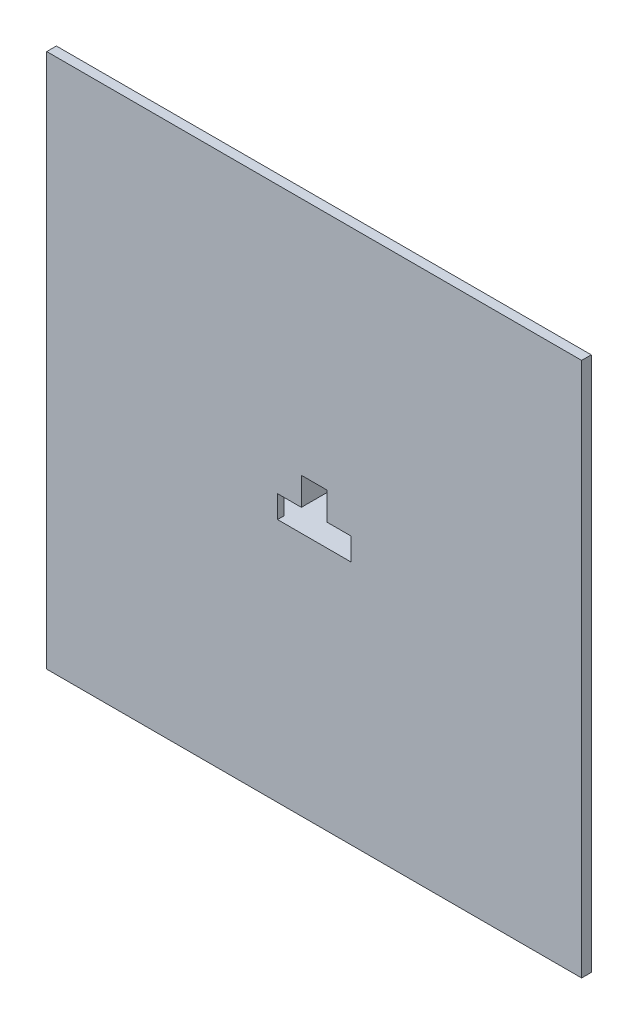
ISO-10303-21;
HEADER;
FILE_DESCRIPTION(('STEP AP214'),'2;1');
FILE_NAME('part.step','',(''),(''),'','','');
FILE_SCHEMA(('AUTOMOTIVE_DESIGN { 1 0 10303 214 1 1 1 1 }'));
ENDSEC;
DATA;
#1=APPLICATION_CONTEXT('core data for automotive mechanical design processes');
#2=APPLICATION_PROTOCOL_DEFINITION('international standard','automotive_design',2000,#1);
#3=PRODUCT_CONTEXT('',#1,'mechanical');
#4=PRODUCT('Part','Part','',(#3));
#5=PRODUCT_RELATED_PRODUCT_CATEGORY('part','',(#4));
#6=PRODUCT_DEFINITION_FORMATION('','',#4);
#7=PRODUCT_DEFINITION_CONTEXT('part definition',#1,'design');
#8=PRODUCT_DEFINITION('design','',#6,#7);
#9=PRODUCT_DEFINITION_SHAPE('','',#8);
#10=(LENGTH_UNIT() NAMED_UNIT(*) SI_UNIT(.MILLI.,.METRE.));
#11=(NAMED_UNIT(*) PLANE_ANGLE_UNIT() SI_UNIT($,.RADIAN.));
#12=(NAMED_UNIT(*) SI_UNIT($,.STERADIAN.) SOLID_ANGLE_UNIT());
#13=UNCERTAINTY_MEASURE_WITH_UNIT(LENGTH_MEASURE(1.E-05),#10,'distance_accuracy_value','');
#14=(GEOMETRIC_REPRESENTATION_CONTEXT(3) GLOBAL_UNCERTAINTY_ASSIGNED_CONTEXT((#13)) GLOBAL_UNIT_ASSIGNED_CONTEXT((#10,
#11,#12)) REPRESENTATION_CONTEXT('',''));
#15=CARTESIAN_POINT('',(0.,0.,0.));
#16=DIRECTION('',(0.,0.,1.));
#17=DIRECTION('',(1.,0.,0.));
#18=AXIS2_PLACEMENT_3D('',#15,#16,#17);
#19=CARTESIAN_POINT('',(0.,0.,3.));
#20=DIRECTION('',(0.,0.,-1.));
#21=DIRECTION('',(-1.,0.,0.));
#22=AXIS2_PLACEMENT_3D('',#19,#20,#21);
#23=PLANE('',#22);
#24=DIRECTION('',(0.,-1.,0.));
#25=VECTOR('',#24,1.);
#26=CARTESIAN_POINT('',(0.,0.,3.));
#27=LINE('',#26,#25);
#28=CARTESIAN_POINT('',(0.,50.,3.));
#29=VERTEX_POINT('',#28);
#30=CARTESIAN_POINT('',(0.,0.,3.));
#31=VERTEX_POINT('',#30);
#32=EDGE_CURVE('E274',#29,#31,#27,.T.);
#33=ORIENTED_EDGE('',*,*,#32,.T.);
#34=DIRECTION('',(1.,0.,0.));
#35=VECTOR('',#34,1.);
#36=CARTESIAN_POINT('',(0.,0.,3.));
#37=LINE('',#36,#35);
#38=CARTESIAN_POINT('',(50.,0.,3.));
#39=VERTEX_POINT('',#38);
#40=EDGE_CURVE('E277',#31,#39,#37,.T.);
#41=ORIENTED_EDGE('',*,*,#40,.T.);
#42=DIRECTION('',(0.,1.,0.));
#43=VECTOR('',#42,1.);
#44=CARTESIAN_POINT('',(50.,0.,3.));
#45=LINE('',#44,#43);
#46=CARTESIAN_POINT('',(50.,50.,3.));
#47=VERTEX_POINT('',#46);
#48=EDGE_CURVE('E280',#39,#47,#45,.T.);
#49=ORIENTED_EDGE('',*,*,#48,.T.);
#50=DIRECTION('',(-1.,0.,0.));
#51=VECTOR('',#50,1.);
#52=CARTESIAN_POINT('',(0.,50.,3.));
#53=LINE('',#52,#51);
#54=EDGE_CURVE('E282',#47,#29,#53,.T.);
#55=ORIENTED_EDGE('',*,*,#54,.T.);
#56=EDGE_LOOP('',(#33,#41,#49,#55));
#57=FACE_BOUND('',#56,.T.);
#58=DIRECTION('',(0.,-1.,0.));
#59=VECTOR('',#58,1.);
#60=CARTESIAN_POINT('',(21.575,0.,3.));
#61=LINE('',#60,#59);
#62=CARTESIAN_POINT('',(21.575,25.,3.));
#63=VERTEX_POINT('',#62);
#64=CARTESIAN_POINT('',(21.575,22.9,3.));
#65=VERTEX_POINT('',#64);
#66=EDGE_CURVE('E182',#63,#65,#61,.T.);
#67=ORIENTED_EDGE('',*,*,#66,.F.);
#68=DIRECTION('',(-1.,0.,0.));
#69=VECTOR('',#68,1.);
#70=CARTESIAN_POINT('',(0.,25.,3.));
#71=LINE('',#70,#69);
#72=CARTESIAN_POINT('',(23.8,25.,3.));
#73=VERTEX_POINT('',#72);
#74=EDGE_CURVE('E176',#73,#63,#71,.T.);
#75=ORIENTED_EDGE('',*,*,#74,.F.);
#76=DIRECTION('',(0.,-1.,0.));
#77=VECTOR('',#76,1.);
#78=CARTESIAN_POINT('',(23.8,0.,3.));
#79=LINE('',#78,#77);
#80=CARTESIAN_POINT('',(23.8,27.6,3.));
#81=VERTEX_POINT('',#80);
#82=EDGE_CURVE('E181',#81,#73,#79,.T.);
#83=ORIENTED_EDGE('',*,*,#82,.F.);
#84=DIRECTION('',(-1.,0.,0.));
#85=VECTOR('',#84,1.);
#86=CARTESIAN_POINT('',(0.,27.6,3.));
#87=LINE('',#86,#85);
#88=CARTESIAN_POINT('',(26.2,27.6,3.));
#89=VERTEX_POINT('',#88);
#90=EDGE_CURVE('E197',#89,#81,#87,.T.);
#91=ORIENTED_EDGE('',*,*,#90,.F.);
#92=DIRECTION('',(0.,1.,0.));
#93=VECTOR('',#92,1.);
#94=CARTESIAN_POINT('',(26.2,0.,3.));
#95=LINE('',#94,#93);
#96=CARTESIAN_POINT('',(26.2,25.,3.));
#97=VERTEX_POINT('',#96);
#98=EDGE_CURVE('E199',#97,#89,#95,.T.);
#99=ORIENTED_EDGE('',*,*,#98,.F.);
#100=CARTESIAN_POINT('',(28.425,25.,3.));
#101=VERTEX_POINT('',#100);
#102=EDGE_CURVE('E184',#101,#97,#71,.T.);
#103=ORIENTED_EDGE('',*,*,#102,.F.);
#104=DIRECTION('',(0.,-1.,0.));
#105=VECTOR('',#104,1.);
#106=CARTESIAN_POINT('',(28.425,0.,3.));
#107=LINE('',#106,#105);
#108=CARTESIAN_POINT('',(28.425,22.9,3.));
#109=VERTEX_POINT('',#108);
#110=EDGE_CURVE('E201',#101,#109,#107,.T.);
#111=ORIENTED_EDGE('',*,*,#110,.T.);
#112=DIRECTION('',(1.,0.,0.));
#113=VECTOR('',#112,1.);
#114=CARTESIAN_POINT('',(0.,22.9,3.));
#115=LINE('',#114,#113);
#116=EDGE_CURVE('E190',#65,#109,#115,.T.);
#117=ORIENTED_EDGE('',*,*,#116,.F.);
#118=EDGE_LOOP('',(#67,#75,#83,#91,#99,#103,#111,#117));
#119=FACE_BOUND('',#118,.T.);
#120=ADVANCED_FACE('F38',(#57,#119),#23,.F.);
#121=CARTESIAN_POINT('',(0.,0.,2.4));
#122=DIRECTION('',(0.,0.,-1.));
#123=DIRECTION('',(-1.,0.,0.));
#124=AXIS2_PLACEMENT_3D('',#121,#122,#123);
#125=PLANE('',#124);
#126=DIRECTION('',(-1.,0.,0.));
#127=VECTOR('',#126,1.);
#128=CARTESIAN_POINT('',(0.,25.,2.4));
#129=LINE('',#128,#127);
#130=CARTESIAN_POINT('',(21.575,25.,2.4));
#131=VERTEX_POINT('',#130);
#132=CARTESIAN_POINT('',(19.35,25.,2.4));
#133=VERTEX_POINT('',#132);
#134=EDGE_CURVE('E219',#131,#133,#129,.T.);
#135=ORIENTED_EDGE('',*,*,#134,.F.);
#136=DIRECTION('',(0.,-1.,0.));
#137=VECTOR('',#136,1.);
#138=CARTESIAN_POINT('',(21.575,0.,2.4));
#139=LINE('',#138,#137);
#140=CARTESIAN_POINT('',(21.575,22.9,2.4));
#141=VERTEX_POINT('',#140);
#142=EDGE_CURVE('E12',#131,#141,#139,.T.);
#143=ORIENTED_EDGE('',*,*,#142,.T.);
#144=DIRECTION('',(-1.,0.,0.));
#145=VECTOR('',#144,1.);
#146=CARTESIAN_POINT('',(0.,22.9,2.4));
#147=LINE('',#146,#145);
#148=CARTESIAN_POINT('',(19.35,22.9,2.4));
#149=VERTEX_POINT('',#148);
#150=EDGE_CURVE('E233',#141,#149,#147,.T.);
#151=ORIENTED_EDGE('',*,*,#150,.T.);
#152=DIRECTION('',(0.,-1.,0.));
#153=VECTOR('',#152,1.);
#154=CARTESIAN_POINT('',(19.35,0.,2.4));
#155=LINE('',#154,#153);
#156=EDGE_CURVE('E216',#133,#149,#155,.T.);
#157=ORIENTED_EDGE('',*,*,#156,.F.);
#158=EDGE_LOOP('',(#135,#143,#151,#157));
#159=FACE_BOUND('',#158,.T.);
#160=ADVANCED_FACE('F380',(#159),#125,.T.);
#161=DIRECTION('',(0.,1.,0.));
#162=VECTOR('',#161,1.);
#163=CARTESIAN_POINT('',(26.2,0.,2.4));
#164=LINE('',#163,#162);
#165=CARTESIAN_POINT('',(26.2,27.6,2.4));
#166=VERTEX_POINT('',#165);
#167=CARTESIAN_POINT('',(26.2,30.2,2.4));
#168=VERTEX_POINT('',#167);
#169=EDGE_CURVE('E228',#166,#168,#164,.T.);
#170=ORIENTED_EDGE('',*,*,#169,.F.);
#171=DIRECTION('',(-1.,0.,0.));
#172=VECTOR('',#171,1.);
#173=CARTESIAN_POINT('',(0.,27.6,2.4));
#174=LINE('',#173,#172);
#175=CARTESIAN_POINT('',(23.8,27.6,2.4));
#176=VERTEX_POINT('',#175);
#177=EDGE_CURVE('E433',#166,#176,#174,.T.);
#178=ORIENTED_EDGE('',*,*,#177,.T.);
#179=DIRECTION('',(0.,1.,0.));
#180=VECTOR('',#179,1.);
#181=CARTESIAN_POINT('',(23.8,0.,2.4));
#182=LINE('',#181,#180);
#183=CARTESIAN_POINT('',(23.8,30.2,2.4));
#184=VERTEX_POINT('',#183);
#185=EDGE_CURVE('E222',#176,#184,#182,.T.);
#186=ORIENTED_EDGE('',*,*,#185,.T.);
#187=DIRECTION('',(-1.,0.,0.));
#188=VECTOR('',#187,1.);
#189=CARTESIAN_POINT('',(0.,30.2,2.4));
#190=LINE('',#189,#188);
#191=EDGE_CURVE('E225',#168,#184,#190,.T.);
#192=ORIENTED_EDGE('',*,*,#191,.F.);
#193=EDGE_LOOP('',(#170,#178,#186,#192));
#194=FACE_BOUND('',#193,.T.);
#195=ADVANCED_FACE('F387',(#194),#125,.T.);
#196=CARTESIAN_POINT('',(25.,25.,-5.));
#197=DIRECTION('',(0.,0.,1.));
#198=DIRECTION('',(1.,0.,0.));
#199=AXIS2_PLACEMENT_3D('',#196,#197,#198);
#200=PLANE('',#199);
#201=CARTESIAN_POINT('',(18.4666338801768,22.4869808418413,-4.99998767551689));
#202=CARTESIAN_POINT('',(18.795587318431,21.6317652174322,-4.99998767551689));
#203=CARTESIAN_POINT('',(19.2944573612224,20.8422932437699,-4.9999876755169));
#204=CARTESIAN_POINT('',(20.5568377598497,19.5138308829034,-4.9999876755169));
#205=CARTESIAN_POINT('',(21.3198514264066,18.9753631852246,-4.99998767551614));
#206=CARTESIAN_POINT('',(22.9945193749621,18.231116064201,-4.99998767551765));
#207=CARTESIAN_POINT('',(23.9055147512842,18.0256294682545,-4.99998767551614));
#208=CARTESIAN_POINT('',(25.7375172355156,17.978902464644,-4.99998767551765));
#209=CARTESIAN_POINT('',(26.6578035337516,18.1376804419247,-4.9999876755184));
#210=CARTESIAN_POINT('',(28.3682347825659,18.7955873184289,-4.99998767551539));
#211=CARTESIAN_POINT('',(29.1577067562301,19.2944573612254,-4.99998767551689));
#212=CARTESIAN_POINT('',(30.4861691170966,20.5568377598467,-4.99998767551689));
#213=CARTESIAN_POINT('',(31.0246368147754,21.3198514264066,-4.99998767551614));
#214=CARTESIAN_POINT('',(31.768883935799,22.9945193749621,-4.99998767551765));
#215=CARTESIAN_POINT('',(31.9743705317455,23.9055147512872,-4.99998767551765));
#216=CARTESIAN_POINT('',(32.0210975353561,25.7375172355126,-4.99998767551614));
#217=CARTESIAN_POINT('',(31.8623195580753,26.6578035337486,-4.99998767551614));
#218=CARTESIAN_POINT('',(31.2044126815711,28.3682347825689,-4.99998767551765));
#219=CARTESIAN_POINT('',(30.7055426387746,29.1577067562301,-4.99998767551614));
#220=CARTESIAN_POINT('',(29.4431622401533,30.4861691170966,-4.99998767551765));
#221=CARTESIAN_POINT('',(28.6801485735934,31.0246368147754,-4.99998767551614));
#222=CARTESIAN_POINT('',(27.0054806250379,31.768883935799,-4.99998767551765));
#223=CARTESIAN_POINT('',(26.0944852487141,31.9743705317458,-4.99998767551765));
#224=CARTESIAN_POINT('',(24.2624827644862,32.0210975353558,-4.99998767551614));
#225=CARTESIAN_POINT('',(23.3421964662504,31.8623195580775,-4.99998767551689));
#226=CARTESIAN_POINT('',(21.6317652174322,31.204412681569,-4.99998767551689));
#227=CARTESIAN_POINT('',(20.8422932437711,30.7055426387762,-4.9999876755169));
#228=CARTESIAN_POINT('',(19.5138308829022,29.4431622401517,-4.9999876755169));
#229=CARTESIAN_POINT('',(18.9753631852232,28.6801485735956,-4.99998767551539));
#230=CARTESIAN_POINT('',(18.2311160642024,27.0054806250358,-4.9999876755184));
#231=CARTESIAN_POINT('',(18.0256294682542,26.0944852487141,-4.99998767551915));
#232=CARTESIAN_POINT('',(17.9789024646442,24.2624827644862,-4.99998767551464));
#233=CARTESIAN_POINT('',(18.1376804419225,23.3421964662504,-4.99998767551689));
#234=CARTESIAN_POINT('',(18.4666338801768,22.4869808418413,-4.99998767551689));
#235=(BOUNDED_CURVE() B_SPLINE_CURVE(3,(#201,#202,#203,#204,#205,#206,#207,#208,#209,#210,#211,
#212,#213,#214,#215,#216,#217,#218,#219,#220,#221,#222,#223,#224,#225,#226,#227,#228,#229,#230,
#231,#232,#233,#234),.UNSPECIFIED.,.T.,.F.) B_SPLINE_CURVE_WITH_KNOTS((4,2,2,2,2,2,2,2,2,2,2,2,
2,2,2,2,4),(5.91598666838352,6.30868575008225,6.70138483178097,7.09408391347969,
7.48678299517842,7.87948207687714,8.27218115857587,8.66488024027459,9.05757932197331,
9.45027840367204,9.84297748537076,10.2356765670695,10.6283756487682,11.0210747304669,
11.4137738121657,11.8064728938644,12.1991719755631),
.UNSPECIFIED.) CURVE() GEOMETRIC_REPRESENTATION_ITEM() RATIONAL_B_SPLINE_CURVE((0.99999973033962,
0.99999973033962,0.99999973033962,0.99999973033962,0.99999973033962,0.99999973033962,
0.99999973033962,0.99999973033962,0.99999973033962,0.99999973033962,0.99999973033962,
0.99999973033962,0.99999973033962,0.99999973033962,0.99999973033962,0.99999973033962,
0.99999973033962,0.99999973033962,0.99999973033962,0.99999973033962,0.99999973033962,
0.99999973033962,0.99999973033962,0.99999973033962,0.99999973033962,0.99999973033962,
0.99999973033962,0.99999973033962,0.99999973033962,0.99999973033962,0.99999973033962,
0.99999973033962,0.99999973033962,0.99999973033962)) REPRESENTATION_ITEM(''));
#236=CARTESIAN_POINT('',(31.9999846066829,24.9999999959394,-4.99998767551676));
#237=VERTEX_POINT('',#236);
#238=EDGE_CURVE('E278',#237,#237,#235,.T.);
#239=ORIENTED_EDGE('',*,*,#238,.F.);
#240=EDGE_LOOP('',(#239));
#241=FACE_BOUND('',#240,.T.);
#242=DIRECTION('',(0.,-1.,0.));
#243=VECTOR('',#242,1.);
#244=CARTESIAN_POINT('',(19.35,0.,-5.));
#245=LINE('',#244,#243);
#246=CARTESIAN_POINT('',(19.35,25.,-5.));
#247=VERTEX_POINT('',#246);
#248=CARTESIAN_POINT('',(19.35,22.9,-5.));
#249=VERTEX_POINT('',#248);
#250=EDGE_CURVE('E206',#247,#249,#245,.T.);
#251=ORIENTED_EDGE('',*,*,#250,.T.);
#252=DIRECTION('',(-1.,0.,0.));
#253=VECTOR('',#252,1.);
#254=CARTESIAN_POINT('',(0.,22.9,-5.));
#255=LINE('',#254,#253);
#256=CARTESIAN_POINT('',(30.65,22.9,-5.));
#257=VERTEX_POINT('',#256);
#258=EDGE_CURVE('E220',#257,#249,#255,.T.);
#259=ORIENTED_EDGE('',*,*,#258,.F.);
#260=DIRECTION('',(0.,-1.,0.));
#261=VECTOR('',#260,1.);
#262=CARTESIAN_POINT('',(30.65,0.,-5.));
#263=LINE('',#262,#261);
#264=CARTESIAN_POINT('',(30.65,25.,-5.));
#265=VERTEX_POINT('',#264);
#266=EDGE_CURVE('E250',#265,#257,#263,.T.);
#267=ORIENTED_EDGE('',*,*,#266,.F.);
#268=DIRECTION('',(-1.,0.,0.));
#269=VECTOR('',#268,1.);
#270=CARTESIAN_POINT('',(0.,25.,-5.));
#271=LINE('',#270,#269);
#272=CARTESIAN_POINT('',(26.2,25.,-5.));
#273=VERTEX_POINT('',#272);
#274=EDGE_CURVE('E243',#265,#273,#271,.T.);
#275=ORIENTED_EDGE('',*,*,#274,.T.);
#276=DIRECTION('',(0.,1.,0.));
#277=VECTOR('',#276,1.);
#278=CARTESIAN_POINT('',(26.2,0.,-5.));
#279=LINE('',#278,#277);
#280=CARTESIAN_POINT('',(26.2,30.2,-5.));
#281=VERTEX_POINT('',#280);
#282=EDGE_CURVE('E248',#273,#281,#279,.T.);
#283=ORIENTED_EDGE('',*,*,#282,.T.);
#284=DIRECTION('',(-1.,0.,0.));
#285=VECTOR('',#284,1.);
#286=CARTESIAN_POINT('',(0.,30.2,-5.));
#287=LINE('',#286,#285);
#288=CARTESIAN_POINT('',(23.8,30.2,-5.));
#289=VERTEX_POINT('',#288);
#290=EDGE_CURVE('E245',#281,#289,#287,.T.);
#291=ORIENTED_EDGE('',*,*,#290,.T.);
#292=DIRECTION('',(0.,1.,0.));
#293=VECTOR('',#292,1.);
#294=CARTESIAN_POINT('',(23.8,0.,-5.));
#295=LINE('',#294,#293);
#296=CARTESIAN_POINT('',(23.8,25.,-5.));
#297=VERTEX_POINT('',#296);
#298=EDGE_CURVE('E242',#297,#289,#295,.T.);
#299=ORIENTED_EDGE('',*,*,#298,.F.);
#300=EDGE_CURVE('E240',#297,#247,#271,.T.);
#301=ORIENTED_EDGE('',*,*,#300,.T.);
#302=EDGE_LOOP('',(#251,#259,#267,#275,#283,#291,#299,#301));
#303=FACE_BOUND('',#302,.T.);
#304=ADVANCED_FACE('F361',(#241,#303),#200,.F.);
#305=CARTESIAN_POINT('',(0.,0.,3.));
#306=DIRECTION('',(1.,0.,0.));
#307=DIRECTION('',(0.,0.,-1.));
#308=AXIS2_PLACEMENT_3D('',#305,#306,#307);
#309=PLANE('',#308);
#310=DIRECTION('',(0.,0.,-1.));
#311=VECTOR('',#310,1.);
#312=CARTESIAN_POINT('',(0.,50.,3.));
#313=LINE('',#312,#311);
#314=CARTESIAN_POINT('',(0.,50.,2.1));
#315=VERTEX_POINT('',#314);
#316=EDGE_CURVE('E284',#29,#315,#313,.T.);
#317=ORIENTED_EDGE('',*,*,#316,.T.);
#318=DIRECTION('',(0.,-1.,0.));
#319=VECTOR('',#318,1.);
#320=CARTESIAN_POINT('',(0.,0.,2.1));
#321=LINE('',#320,#319);
#322=CARTESIAN_POINT('',(0.,0.,2.1));
#323=VERTEX_POINT('',#322);
#324=EDGE_CURVE('E310',#315,#323,#321,.T.);
#325=ORIENTED_EDGE('',*,*,#324,.T.);
#326=DIRECTION('',(0.,0.,-1.));
#327=VECTOR('',#326,1.);
#328=CARTESIAN_POINT('',(0.,0.,3.));
#329=LINE('',#328,#327);
#330=EDGE_CURVE('E293',#31,#323,#329,.T.);
#331=ORIENTED_EDGE('',*,*,#330,.F.);
#332=ORIENTED_EDGE('',*,*,#32,.F.);
#333=EDGE_LOOP('',(#317,#325,#331,#332));
#334=FACE_BOUND('',#333,.T.);
#335=ADVANCED_FACE('F357',(#334),#309,.F.);
#336=CARTESIAN_POINT('',(0.,0.,3.));
#337=DIRECTION('',(0.,1.,0.));
#338=DIRECTION('',(0.,0.,1.));
#339=AXIS2_PLACEMENT_3D('',#336,#337,#338);
#340=PLANE('',#339);
#341=ORIENTED_EDGE('',*,*,#330,.T.);
#342=DIRECTION('',(1.,0.,0.));
#343=VECTOR('',#342,1.);
#344=CARTESIAN_POINT('',(50.,0.,2.1));
#345=LINE('',#344,#343);
#346=CARTESIAN_POINT('',(50.,0.,2.1));
#347=VERTEX_POINT('',#346);
#348=EDGE_CURVE('E308',#323,#347,#345,.T.);
#349=ORIENTED_EDGE('',*,*,#348,.T.);
#350=DIRECTION('',(0.,0.,-1.));
#351=VECTOR('',#350,1.);
#352=CARTESIAN_POINT('',(50.,0.,3.));
#353=LINE('',#352,#351);
#354=EDGE_CURVE('E290',#39,#347,#353,.T.);
#355=ORIENTED_EDGE('',*,*,#354,.F.);
#356=ORIENTED_EDGE('',*,*,#40,.F.);
#357=EDGE_LOOP('',(#341,#349,#355,#356));
#358=FACE_BOUND('',#357,.T.);
#359=ADVANCED_FACE('F353',(#358),#340,.F.);
#360=CARTESIAN_POINT('',(50.,0.,3.));
#361=DIRECTION('',(-1.,0.,0.));
#362=DIRECTION('',(0.,0.,1.));
#363=AXIS2_PLACEMENT_3D('',#360,#361,#362);
#364=PLANE('',#363);
#365=ORIENTED_EDGE('',*,*,#354,.T.);
#366=DIRECTION('',(0.,1.,0.));
#367=VECTOR('',#366,1.);
#368=CARTESIAN_POINT('',(50.,50.,2.1));
#369=LINE('',#368,#367);
#370=CARTESIAN_POINT('',(50.,50.,2.1));
#371=VERTEX_POINT('',#370);
#372=EDGE_CURVE('E296',#347,#371,#369,.T.);
#373=ORIENTED_EDGE('',*,*,#372,.T.);
#374=DIRECTION('',(0.,0.,-1.));
#375=VECTOR('',#374,1.);
#376=CARTESIAN_POINT('',(50.,50.,3.));
#377=LINE('',#376,#375);
#378=EDGE_CURVE('E287',#47,#371,#377,.T.);
#379=ORIENTED_EDGE('',*,*,#378,.F.);
#380=ORIENTED_EDGE('',*,*,#48,.F.);
#381=EDGE_LOOP('',(#365,#373,#379,#380));
#382=FACE_BOUND('',#381,.T.);
#383=ADVANCED_FACE('F349',(#382),#364,.F.);
#384=CARTESIAN_POINT('',(0.,50.,3.));
#385=DIRECTION('',(0.,-1.,0.));
#386=DIRECTION('',(0.,0.,-1.));
#387=AXIS2_PLACEMENT_3D('',#384,#385,#386);
#388=PLANE('',#387);
#389=ORIENTED_EDGE('',*,*,#378,.T.);
#390=DIRECTION('',(-1.,0.,0.));
#391=VECTOR('',#390,1.);
#392=CARTESIAN_POINT('',(0.,50.,2.1));
#393=LINE('',#392,#391);
#394=EDGE_CURVE('E312',#371,#315,#393,.T.);
#395=ORIENTED_EDGE('',*,*,#394,.T.);
#396=ORIENTED_EDGE('',*,*,#316,.F.);
#397=ORIENTED_EDGE('',*,*,#54,.F.);
#398=EDGE_LOOP('',(#389,#395,#396,#397));
#399=FACE_BOUND('',#398,.T.);
#400=ADVANCED_FACE('F345',(#399),#388,.F.);
#401=CARTESIAN_POINT('',(0.,0.,0.));
#402=DIRECTION('',(0.,0.,-1.));
#403=DIRECTION('',(-1.,0.,0.));
#404=AXIS2_PLACEMENT_3D('',#401,#402,#403);
#405=PLANE('',#404);
#406=CARTESIAN_POINT('',(12.637957257492,20.245016171428,0.));
#407=CARTESIAN_POINT('',(12.01553133042,21.8632037808604,0.));
#408=CARTESIAN_POINT('',(11.7151011837458,23.6045142088287,0.));
#409=CARTESIAN_POINT('',(11.8035152118716,27.0709192133854,0.));
#410=CARTESIAN_POINT('',(12.1923245997922,28.794649917252,0.));
#411=CARTESIAN_POINT('',(13.6005442758857,31.9633559686074,0.));
#412=CARTESIAN_POINT('',(14.6194004936583,33.4070845743655,0.));
#413=CARTESIAN_POINT('',(17.1330371375681,35.7956849005834,0.));
#414=CARTESIAN_POINT('',(18.6268285619926,36.7396168154422,0.));
#415=CARTESIAN_POINT('',(21.8632037808634,37.9844686695739,0.));
#416=CARTESIAN_POINT('',(23.6045142088257,38.2848988162542,0.));
#417=CARTESIAN_POINT('',(27.0709192133884,38.1964847881284,0.));
#418=CARTESIAN_POINT('',(28.7946499172544,37.8076754002116,0.));
#419=CARTESIAN_POINT('',(31.963355968605,36.3994557241105,0.));
#420=CARTESIAN_POINT('',(33.4070845743634,35.3805995063444,0.));
#421=CARTESIAN_POINT('',(35.7956849005854,32.8669628624292,0.));
#422=CARTESIAN_POINT('',(36.7396168154469,31.3731714380084,0.));
#423=CARTESIAN_POINT('',(37.9844686695693,28.1367962191356,0.));
#424=CARTESIAN_POINT('',(38.2848988162547,26.3954857911737,0.));
#425=CARTESIAN_POINT('',(38.1964847881279,22.9290807866122,0.));
#426=CARTESIAN_POINT('',(37.8076754002116,21.2053500827456,0.));
#427=CARTESIAN_POINT('',(36.3994557241105,18.036644031395,0.));
#428=CARTESIAN_POINT('',(35.3805995063384,16.5929154256305,0.));
#429=CARTESIAN_POINT('',(32.8669628624352,14.2043150994206,0.));
#430=CARTESIAN_POINT('',(31.3731714380055,13.2603831845577,0.));
#431=CARTESIAN_POINT('',(28.1367962191387,12.0155313304263,0.));
#432=CARTESIAN_POINT('',(26.3954857911767,11.7151011837453,0.));
#433=CARTESIAN_POINT('',(22.9290807866092,11.8035152118721,0.));
#434=CARTESIAN_POINT('',(21.2053500827456,12.1923245997914,0.));
#435=CARTESIAN_POINT('',(18.036644031395,13.6005442758865,0.));
#436=CARTESIAN_POINT('',(16.5929154256366,14.6194004936586,0.));
#437=CARTESIAN_POINT('',(14.2043150994146,17.1330371375678,0.));
#438=CARTESIAN_POINT('',(13.2603831845639,18.6268285619955,0.));
#439=CARTESIAN_POINT('',(12.637957257492,20.245016171428,0.));
#440=(BOUNDED_CURVE() B_SPLINE_CURVE(3,(#406,#407,#408,#409,#410,#411,#412,#413,#414,#415,#416,
#417,#418,#419,#420,#421,#422,#423,#424,#425,#426,#427,#428,#429,#430,#431,#432,#433,#434,#435,
#436,#437,#438,#439),.UNSPECIFIED.,.T.,.F.) B_SPLINE_CURVE_WITH_KNOTS((4,2,2,2,2,2,2,2,2,2,2,2,
2,2,2,2,4),(5.91598666838352,6.30868575008225,6.70138483178097,7.09408391347969,
7.48678299517842,7.87948207687714,8.27218115857587,8.66488024027459,9.05757932197331,
9.45027840367204,9.84297748537076,10.2356765670695,10.6283756487682,11.0210747304669,
11.4137738121657,11.8064728938644,12.1991719755631),
.UNSPECIFIED.) CURVE() GEOMETRIC_REPRESENTATION_ITEM() RATIONAL_B_SPLINE_CURVE((1.,1.,1.,1.,1.,
1.,1.,1.,1.,1.,1.,1.,1.,1.,1.,1.,1.,1.,1.,1.,1.,1.,1.,1.,1.,1.,1.,1.,1.,1.,1.,1.,1.,1.)) REPRESENTATION_ITEM(''));
#441=CARTESIAN_POINT('',(12.637957257492,20.245016171428,0.));
#442=VERTEX_POINT('',#441);
#443=EDGE_CURVE('E314',#442,#442,#440,.F.);
#444=ORIENTED_EDGE('',*,*,#443,.T.);
#445=EDGE_LOOP('',(#444));
#446=FACE_BOUND('',#445,.T.);
#447=DIRECTION('',(1.,0.,0.));
#448=VECTOR('',#447,1.);
#449=CARTESIAN_POINT('',(50.,38.9999999999998,0.));
#450=LINE('',#449,#448);
#451=CARTESIAN_POINT('',(11.0000000000002,38.9999999999998,0.));
#452=VERTEX_POINT('',#451);
#453=CARTESIAN_POINT('',(38.9999999999998,38.9999999999998,0.));
#454=VERTEX_POINT('',#453);
#455=EDGE_CURVE('E299',#452,#454,#450,.T.);
#456=ORIENTED_EDGE('',*,*,#455,.T.);
#457=DIRECTION('',(0.,-1.,0.));
#458=VECTOR('',#457,1.);
#459=CARTESIAN_POINT('',(38.9999999999998,0.,0.));
#460=LINE('',#459,#458);
#461=CARTESIAN_POINT('',(38.9999999999998,11.0000000000002,0.));
#462=VERTEX_POINT('',#461);
#463=EDGE_CURVE('E305',#454,#462,#460,.T.);
#464=ORIENTED_EDGE('',*,*,#463,.T.);
#465=DIRECTION('',(-1.,0.,0.));
#466=VECTOR('',#465,1.);
#467=CARTESIAN_POINT('',(0.,11.0000000000002,0.));
#468=LINE('',#467,#466);
#469=CARTESIAN_POINT('',(11.0000000000002,11.0000000000002,0.));
#470=VERTEX_POINT('',#469);
#471=EDGE_CURVE('E303',#462,#470,#468,.T.);
#472=ORIENTED_EDGE('',*,*,#471,.T.);
#473=DIRECTION('',(0.,1.,0.));
#474=VECTOR('',#473,1.);
#475=CARTESIAN_POINT('',(11.0000000000002,50.,0.));
#476=LINE('',#475,#474);
#477=EDGE_CURVE('E301',#470,#452,#476,.T.);
#478=ORIENTED_EDGE('',*,*,#477,.T.);
#479=EDGE_LOOP('',(#456,#464,#472,#478));
#480=FACE_BOUND('',#479,.T.);
#481=ADVANCED_FACE('F334',(#446,#480),#405,.T.);
#482=CARTESIAN_POINT('',(0.,0.,2.1));
#483=DIRECTION('',(-0.187522425100243,0.,-0.982260321953668));
#484=DIRECTION('',(0.,1.,0.));
#485=AXIS2_PLACEMENT_3D('',#482,#483,#484);
#486=PLANE('',#485);
#487=DIRECTION('',(-0.70075066859283,0.70075066859283,0.133779673094993));
#488=VECTOR('',#487,1.);
#489=CARTESIAN_POINT('',(0.,50.,2.1));
#490=LINE('',#489,#488);
#491=EDGE_CURVE('E318',#452,#315,#490,.T.);
#492=ORIENTED_EDGE('',*,*,#491,.F.);
#493=ORIENTED_EDGE('',*,*,#477,.F.);
#494=DIRECTION('',(-0.70075066859283,-0.70075066859283,0.133779673094993));
#495=VECTOR('',#494,1.);
#496=CARTESIAN_POINT('',(0.,0.,2.1));
#497=LINE('',#496,#495);
#498=EDGE_CURVE('E321',#323,#470,#497,.F.);
#499=ORIENTED_EDGE('',*,*,#498,.F.);
#500=ORIENTED_EDGE('',*,*,#324,.F.);
#501=EDGE_LOOP('',(#492,#493,#499,#500));
#502=FACE_BOUND('',#501,.T.);
#503=ADVANCED_FACE('F344',(#502),#486,.T.);
#504=CARTESIAN_POINT('',(0.,0.,2.1));
#505=DIRECTION('',(0.,-0.187522425100243,-0.982260321953668));
#506=DIRECTION('',(-1.,0.,0.));
#507=AXIS2_PLACEMENT_3D('',#504,#505,#506);
#508=PLANE('',#507);
#509=ORIENTED_EDGE('',*,*,#498,.T.);
#510=ORIENTED_EDGE('',*,*,#471,.F.);
#511=DIRECTION('',(0.70075066859283,-0.70075066859283,0.133779673094993));
#512=VECTOR('',#511,1.);
#513=CARTESIAN_POINT('',(25.4474250233351,24.5525749766649,-2.58730976827231));
#514=LINE('',#513,#512);
#515=EDGE_CURVE('E316',#347,#462,#514,.F.);
#516=ORIENTED_EDGE('',*,*,#515,.F.);
#517=ORIENTED_EDGE('',*,*,#348,.F.);
#518=EDGE_LOOP('',(#509,#510,#516,#517));
#519=FACE_BOUND('',#518,.T.);
#520=ADVANCED_FACE('F370',(#519),#508,.T.);
#521=CARTESIAN_POINT('',(0.,50.,2.1));
#522=DIRECTION('',(0.,0.187522425100243,-0.982260321953668));
#523=DIRECTION('',(1.,0.,0.));
#524=AXIS2_PLACEMENT_3D('',#521,#522,#523);
#525=PLANE('',#524);
#526=ORIENTED_EDGE('',*,*,#491,.T.);
#527=ORIENTED_EDGE('',*,*,#394,.F.);
#528=DIRECTION('',(-0.70075066859283,-0.70075066859283,-0.133779673094993));
#529=VECTOR('',#528,1.);
#530=CARTESIAN_POINT('',(25.4474250233351,25.4474250233351,-2.58730976827231));
#531=LINE('',#530,#529);
#532=EDGE_CURVE('E257',#454,#371,#531,.F.);
#533=ORIENTED_EDGE('',*,*,#532,.F.);
#534=ORIENTED_EDGE('',*,*,#455,.F.);
#535=EDGE_LOOP('',(#526,#527,#533,#534));
#536=FACE_BOUND('',#535,.T.);
#537=ADVANCED_FACE('F366',(#536),#525,.T.);
#538=CARTESIAN_POINT('',(50.,0.,2.1));
#539=DIRECTION('',(0.187522425100243,0.,-0.982260321953668));
#540=DIRECTION('',(0.,-1.,0.));
#541=AXIS2_PLACEMENT_3D('',#538,#539,#540);
#542=PLANE('',#541);
#543=ORIENTED_EDGE('',*,*,#515,.T.);
#544=ORIENTED_EDGE('',*,*,#463,.F.);
#545=ORIENTED_EDGE('',*,*,#532,.T.);
#546=ORIENTED_EDGE('',*,*,#372,.F.);
#547=EDGE_LOOP('',(#543,#544,#545,#546));
#548=FACE_BOUND('',#547,.T.);
#549=ADVANCED_FACE('F363',(#548),#542,.T.);
#550=CARTESIAN_POINT('',(18.4666430898653,22.4869843842914,-5.));
#551=CARTESIAN_POINT('',(18.1376901153167,23.3421988031551,-5.));
#552=CARTESIAN_POINT('',(17.978912361858,24.2624838041194,-4.99999999999774));
#553=CARTESIAN_POINT('',(18.0256392995998,26.0944837058848,-5.00000000000226));
#554=CARTESIAN_POINT('',(18.231125605886,27.0054777980318,-5.0000000000015));
#555=CARTESIAN_POINT('',(18.975371677787,28.6801433859142,-4.9999999999985));
#556=CARTESIAN_POINT('',(19.5138386164208,29.4431559768963,-5.));
#557=CARTESIAN_POINT('',(20.8422991046373,30.70553459602,-5.));
#558=CARTESIAN_POINT('',(21.6317699654277,31.2044039355861,-5.));
#559=CARTESIAN_POINT('',(23.3421988031551,31.8623098846833,-5.));
#560=CARTESIAN_POINT('',(24.2624838041194,32.021087638142,-4.99999999999925));
#561=CARTESIAN_POINT('',(26.0944837058848,31.9743607004002,-5.00000000000075));
#562=CARTESIAN_POINT('',(27.005477798034,31.7688743941154,-5.00000000000075));
#563=CARTESIAN_POINT('',(28.680143385912,31.0246283222116,-4.99999999999925));
#564=CARTESIAN_POINT('',(29.4431559768979,30.486161383578,-5.00000000000075));
#565=CARTESIAN_POINT('',(30.7055345960184,29.1577008953639,-4.99999999999925));
#566=CARTESIAN_POINT('',(31.2044039355882,28.3682300345733,-5.00000000000075));
#567=CARTESIAN_POINT('',(31.8623098846812,26.6578011968438,-4.99999999999925));
#568=CARTESIAN_POINT('',(32.0210876381422,25.7375161958794,-4.99999999999925));
#569=CARTESIAN_POINT('',(31.9743607003999,23.9055162941164,-5.00000000000075));
#570=CARTESIAN_POINT('',(31.7688743941154,22.994522201966,-5.00000000000075));
#571=CARTESIAN_POINT('',(31.0246283222116,21.319856614088,-4.99999999999925));
#572=CARTESIAN_POINT('',(30.486161383578,20.5568440231021,-5.));
#573=CARTESIAN_POINT('',(29.1577008953639,19.2944654039816,-5.));
#574=CARTESIAN_POINT('',(28.3682300345704,18.7955960644118,-4.9999999999985));
#575=CARTESIAN_POINT('',(26.6578011968469,18.1376901153189,-5.0000000000015));
#576=CARTESIAN_POINT('',(25.7375161958824,17.9789123618578,-5.00000000000075));
#577=CARTESIAN_POINT('',(23.9055162941134,18.0256392996001,-4.99999999999925));
#578=CARTESIAN_POINT('',(22.994522201966,18.2311256058846,-5.00000000000075));
#579=CARTESIAN_POINT('',(21.319856614088,18.9753716777884,-4.99999999999925));
#580=CARTESIAN_POINT('',(20.5568440231051,19.513838616422,-5.));
#581=CARTESIAN_POINT('',(19.2944654039786,20.8422991046361,-5.));
#582=CARTESIAN_POINT('',(18.7955960644139,21.6317699654277,-5.));
#583=CARTESIAN_POINT('',(18.4666430898653,22.4869843842914,-5.));
#584=CARTESIAN_POINT('',(14.7303060178311,21.0498252734815,0.));
#585=CARTESIAN_POINT('',(14.2132293557753,22.3941250709156,0.));
#586=CARTESIAN_POINT('',(13.9636487861438,23.8407084225222,0.));
#587=CARTESIAN_POINT('',(14.0370982177239,26.7204039030011,0.));
#588=CARTESIAN_POINT('',(14.3600993199304,28.152383002658,0.));
#589=CARTESIAN_POINT('',(15.5299694970791,30.7847668363606,0.));
#590=CARTESIAN_POINT('',(16.3763782813149,31.9841358470733,0.));
#591=CARTESIAN_POINT('',(18.4645670744665,33.9684514579152,0.));
#592=CARTESIAN_POINT('',(19.7055254760474,34.7526173201041,0.));
#593=CARTESIAN_POINT('',(22.3941250709156,35.7867706442337,0.));
#594=CARTESIAN_POINT('',(23.8407084225192,36.0363512138547,3.0076049007005E-12));
#595=CARTESIAN_POINT('',(26.7204039030042,35.9629017822776,-3.0076049007005E-12));
#596=CARTESIAN_POINT('',(28.1523830026606,35.6399006800705,1.50553717384392E-12));
#597=CARTESIAN_POINT('',(30.7847668363581,34.47003050292,-1.50206772689197E-12));
#598=CARTESIAN_POINT('',(31.9841358470737,33.6236217186884,-1.50206772689197E-12));
#599=CARTESIAN_POINT('',(33.9684514579148,31.5354329255303,1.50553717384392E-12));
#600=CARTESIAN_POINT('',(34.7526173201101,30.2944745239533,-1.50206772689197E-12));
#601=CARTESIAN_POINT('',(35.7867706442278,27.6058749290836,1.50553717384392E-12));
#602=CARTESIAN_POINT('',(36.0363512138611,26.1592915774767,1.50380245036794E-12));
#603=CARTESIAN_POINT('',(35.9629017822711,23.279596097,-1.50380245036794E-12));
#604=CARTESIAN_POINT('',(35.6399006800705,21.8476169973394,1.50380245036794E-12));
#605=CARTESIAN_POINT('',(34.47003050292,19.2152331636419,-1.50380245036794E-12));
#606=CARTESIAN_POINT('',(33.6236217186763,18.0158641529263,0.));
#607=CARTESIAN_POINT('',(31.5354329255423,16.0315485420852,0.));
#608=CARTESIAN_POINT('',(30.2944745239534,15.24738267989,0.));
#609=CARTESIAN_POINT('',(27.6058749290837,14.2132293557723,0.));
#610=CARTESIAN_POINT('',(26.1592915774797,13.9636487861449,1.50380245036794E-12));
#611=CARTESIAN_POINT('',(23.279596096997,14.0370982177229,-1.50380245036794E-12));
#612=CARTESIAN_POINT('',(21.8476169973394,14.360099319928,-1.50380245036794E-12));
#613=CARTESIAN_POINT('',(19.2152331636419,15.5299694970815,1.50380245036794E-12));
#614=CARTESIAN_POINT('',(18.0158641529324,16.3763782813176,0.));
#615=CARTESIAN_POINT('',(16.0315485420792,18.4645670744637,0.));
#616=CARTESIAN_POINT('',(15.2473826798869,19.7055254760474,0.));
#617=CARTESIAN_POINT('',(14.7303060178311,21.0498252734815,0.));
#618=CARTESIAN_POINT('',(12.6379572574919,20.245016171428,0.));
#619=CARTESIAN_POINT('',(12.01553133042,21.8632037808604,0.));
#620=CARTESIAN_POINT('',(11.7151011837458,23.6045142088287,0.));
#621=CARTESIAN_POINT('',(11.8035152118716,27.0709192133854,0.));
#622=CARTESIAN_POINT('',(12.1923245997922,28.794649917252,0.));
#623=CARTESIAN_POINT('',(13.6005442758857,31.9633559686074,0.));
#624=CARTESIAN_POINT('',(14.6194004936583,33.4070845743655,0.));
#625=CARTESIAN_POINT('',(17.1330371375681,35.7956849005834,0.));
#626=CARTESIAN_POINT('',(18.6268285619925,36.7396168154422,0.));
#627=CARTESIAN_POINT('',(21.8632037808634,37.984468669574,0.));
#628=CARTESIAN_POINT('',(23.6045142088257,38.2848988162542,0.));
#629=CARTESIAN_POINT('',(27.0709192133884,38.1964847881284,0.));
#630=CARTESIAN_POINT('',(28.7946499172544,37.8076754002116,0.));
#631=CARTESIAN_POINT('',(31.963355968605,36.3994557241105,0.));
#632=CARTESIAN_POINT('',(33.4070845743634,35.3805995063444,0.));
#633=CARTESIAN_POINT('',(35.7956849005854,32.8669628624292,0.));
#634=CARTESIAN_POINT('',(36.7396168154469,31.3731714380084,0.));
#635=CARTESIAN_POINT('',(37.9844686695693,28.1367962191356,0.));
#636=CARTESIAN_POINT('',(38.2848988162548,26.3954857911737,0.));
#637=CARTESIAN_POINT('',(38.1964847881279,22.9290807866122,0.));
#638=CARTESIAN_POINT('',(37.8076754002116,21.2053500827456,0.));
#639=CARTESIAN_POINT('',(36.3994557241105,18.036644031395,0.));
#640=CARTESIAN_POINT('',(35.3805995063384,16.5929154256305,0.));
#641=CARTESIAN_POINT('',(32.8669628624352,14.2043150994206,0.));
#642=CARTESIAN_POINT('',(31.3731714380055,13.2603831845577,0.));
#643=CARTESIAN_POINT('',(28.1367962191387,12.0155313304263,0.));
#644=CARTESIAN_POINT('',(26.3954857911767,11.7151011837452,0.));
#645=CARTESIAN_POINT('',(22.9290807866092,11.8035152118721,0.));
#646=CARTESIAN_POINT('',(21.2053500827456,12.1923245997914,0.));
#647=CARTESIAN_POINT('',(18.036644031395,13.6005442758865,0.));
#648=CARTESIAN_POINT('',(16.5929154256366,14.6194004936586,0.));
#649=CARTESIAN_POINT('',(14.2043150994146,17.1330371375678,0.));
#650=CARTESIAN_POINT('',(13.2603831845639,18.6268285619955,0.));
#651=CARTESIAN_POINT('',(12.6379572574919,20.245016171428,0.));
#652=(BOUNDED_SURFACE() B_SPLINE_SURFACE(2,3,((#550,#551,#552,#553,#554,#555,#556,#557,#558,
#559,#560,#561,#562,#563,#564,#565,#566,#567,#568,#569,#570,#571,#572,#573,#574,#575,#576,#577,
#578,#579,#580,#581,#582,#583),(#584,#585,#586,#587,#588,#589,#590,#591,#592,#593,#594,#595,
#596,#597,#598,#599,#600,#601,#602,#603,#604,#605,#606,#607,#608,#609,#610,#611,#612,#613,#614,
#615,#616,#617),(#618,#619,#620,#621,#622,#623,#624,#625,#626,#627,#628,#629,#630,#631,#632,
#633,#634,#635,#636,#637,#638,#639,#640,#641,#642,#643,#644,#645,#646,#647,#648,#649,#650,
#651)),.UNSPECIFIED.,.F.,.T.,.F.) B_SPLINE_SURFACE_WITH_KNOTS((3,3),(4,2,2,2,2,2,2,2,2,2,2,2,2,
2,2,2,4),(0.,1.),(5.91598666838352,6.30868575008225,6.70138483178097,7.09408391347969,
7.48678299517842,7.87948207687714,8.27218115857587,8.66488024027459,9.05757932197331,
9.45027840367204,9.84297748537076,10.2356765670695,10.6283756487682,11.0210747304669,
11.4137738121657,11.8064728938644,12.1991719755631),
.UNSPECIFIED.) GEOMETRIC_REPRESENTATION_ITEM() RATIONAL_B_SPLINE_SURFACE(((1.,1.,1.,1.,1.,1.,1.,
1.,1.,1.,1.,1.,1.,1.,1.,1.,1.,1.,1.,1.,1.,1.,1.,1.,1.,1.,1.,1.,1.,1.,1.,1.,1.,1.),
(0.901387818865997,0.901387818865997,0.901387818865997,0.901387818865997,0.901387818865997,
0.901387818865997,0.901387818865997,0.901387818865997,0.901387818865997,0.901387818865997,
0.901387818865997,0.901387818865997,0.901387818865997,0.901387818865997,0.901387818865997,
0.901387818865997,0.901387818865997,0.901387818865997,0.901387818865997,0.901387818865997,
0.901387818865997,0.901387818865997,0.901387818865997,0.901387818865997,0.901387818865997,
0.901387818865997,0.901387818865997,0.901387818865997,0.901387818865997,0.901387818865997,
0.901387818865997,0.901387818865997,0.901387818865997,0.901387818865997),(1.,1.,1.,1.,1.,1.,1.,
1.,1.,1.,1.,1.,1.,1.,1.,1.,1.,1.,1.,1.,1.,1.,1.,1.,1.,1.,1.,1.,1.,1.,1.,1.,1.,1.))) REPRESENTATION_ITEM('') SURFACE());
#653=ORIENTED_EDGE('',*,*,#443,.F.);
#654=EDGE_LOOP('',(#653));
#655=FACE_BOUND('',#654,.T.);
#656=ORIENTED_EDGE('',*,*,#238,.T.);
#657=EDGE_LOOP('',(#656));
#658=FACE_BOUND('',#657,.T.);
#659=ADVANCED_FACE('F41',(#655,#658),#652,.T.);
#660=CARTESIAN_POINT('',(19.35,0.,2.4));
#661=DIRECTION('',(1.,0.,0.));
#662=DIRECTION('',(0.,0.,-1.));
#663=AXIS2_PLACEMENT_3D('',#660,#661,#662);
#664=PLANE('',#663);
#665=ORIENTED_EDGE('',*,*,#250,.F.);
#666=DIRECTION('',(0.,0.,-1.));
#667=VECTOR('',#666,1.);
#668=CARTESIAN_POINT('',(19.35,25.,2.4));
#669=LINE('',#668,#667);
#670=EDGE_CURVE('E237',#133,#247,#669,.T.);
#671=ORIENTED_EDGE('',*,*,#670,.F.);
#672=ORIENTED_EDGE('',*,*,#156,.T.);
#673=DIRECTION('',(0.,0.,-1.));
#674=VECTOR('',#673,1.);
#675=CARTESIAN_POINT('',(19.35,22.9,2.4));
#676=LINE('',#675,#674);
#677=EDGE_CURVE('E254',#149,#249,#676,.T.);
#678=ORIENTED_EDGE('',*,*,#677,.T.);
#679=EDGE_LOOP('',(#665,#671,#672,#678));
#680=FACE_BOUND('',#679,.T.);
#681=ADVANCED_FACE('F458',(#680),#664,.T.);
#682=CARTESIAN_POINT('',(0.,22.9,2.4));
#683=DIRECTION('',(0.,-1.,0.));
#684=DIRECTION('',(0.,0.,-1.));
#685=AXIS2_PLACEMENT_3D('',#682,#683,#684);
#686=PLANE('',#685);
#687=ORIENTED_EDGE('',*,*,#258,.T.);
#688=ORIENTED_EDGE('',*,*,#677,.F.);
#689=ORIENTED_EDGE('',*,*,#150,.F.);
#690=DIRECTION('',(0.,0.,-1.));
#691=VECTOR('',#690,1.);
#692=CARTESIAN_POINT('',(21.575,22.9,3.));
#693=LINE('',#692,#691);
#694=EDGE_CURVE('E204',#65,#141,#693,.T.);
#695=ORIENTED_EDGE('',*,*,#694,.F.);
#696=ORIENTED_EDGE('',*,*,#116,.T.);
#697=DIRECTION('',(0.,0.,-1.));
#698=VECTOR('',#697,1.);
#699=CARTESIAN_POINT('',(28.425,22.9,3.));
#700=LINE('',#699,#698);
#701=CARTESIAN_POINT('',(28.425,22.9,2.4));
#702=VERTEX_POINT('',#701);
#703=EDGE_CURVE('E207',#109,#702,#700,.T.);
#704=ORIENTED_EDGE('',*,*,#703,.T.);
#705=CARTESIAN_POINT('',(30.65,22.9,2.4));
#706=VERTEX_POINT('',#705);
#707=EDGE_CURVE('E234',#706,#702,#147,.T.);
#708=ORIENTED_EDGE('',*,*,#707,.F.);
#709=DIRECTION('',(0.,0.,-1.));
#710=VECTOR('',#709,1.);
#711=CARTESIAN_POINT('',(30.65,22.9,2.4));
#712=LINE('',#711,#710);
#713=EDGE_CURVE('E258',#706,#257,#712,.T.);
#714=ORIENTED_EDGE('',*,*,#713,.T.);
#715=EDGE_LOOP('',(#687,#688,#689,#695,#696,#704,#708,#714));
#716=FACE_BOUND('',#715,.T.);
#717=ADVANCED_FACE('F443',(#716),#686,.F.);
#718=CARTESIAN_POINT('',(30.65,0.,2.4));
#719=DIRECTION('',(1.,0.,0.));
#720=DIRECTION('',(0.,0.,-1.));
#721=AXIS2_PLACEMENT_3D('',#718,#719,#720);
#722=PLANE('',#721);
#723=ORIENTED_EDGE('',*,*,#266,.T.);
#724=ORIENTED_EDGE('',*,*,#713,.F.);
#725=DIRECTION('',(0.,-1.,0.));
#726=VECTOR('',#725,1.);
#727=CARTESIAN_POINT('',(30.65,0.,2.4));
#728=LINE('',#727,#726);
#729=CARTESIAN_POINT('',(30.65,25.,2.4));
#730=VERTEX_POINT('',#729);
#731=EDGE_CURVE('E230',#730,#706,#728,.T.);
#732=ORIENTED_EDGE('',*,*,#731,.F.);
#733=DIRECTION('',(0.,0.,-1.));
#734=VECTOR('',#733,1.);
#735=CARTESIAN_POINT('',(30.65,25.,2.4));
#736=LINE('',#735,#734);
#737=EDGE_CURVE('E260',#730,#265,#736,.T.);
#738=ORIENTED_EDGE('',*,*,#737,.T.);
#739=EDGE_LOOP('',(#723,#724,#732,#738));
#740=FACE_BOUND('',#739,.T.);
#741=ADVANCED_FACE('F440',(#740),#722,.F.);
#742=CARTESIAN_POINT('',(0.,25.,2.4));
#743=DIRECTION('',(0.,-1.,0.));
#744=DIRECTION('',(0.,0.,-1.));
#745=AXIS2_PLACEMENT_3D('',#742,#743,#744);
#746=PLANE('',#745);
#747=CARTESIAN_POINT('',(28.425,25.,2.4));
#748=VERTEX_POINT('',#747);
#749=EDGE_CURVE('E223',#730,#748,#129,.T.);
#750=ORIENTED_EDGE('',*,*,#749,.T.);
#751=DIRECTION('',(0.,0.,-1.));
#752=VECTOR('',#751,1.);
#753=CARTESIAN_POINT('',(28.425,25.,3.));
#754=LINE('',#753,#752);
#755=EDGE_CURVE('E210',#101,#748,#754,.T.);
#756=ORIENTED_EDGE('',*,*,#755,.F.);
#757=ORIENTED_EDGE('',*,*,#102,.T.);
#758=DIRECTION('',(0.,0.,-1.));
#759=VECTOR('',#758,1.);
#760=CARTESIAN_POINT('',(26.2,25.,2.4));
#761=LINE('',#760,#759);
#762=EDGE_CURVE('E262',#97,#273,#761,.T.);
#763=ORIENTED_EDGE('',*,*,#762,.T.);
#764=ORIENTED_EDGE('',*,*,#274,.F.);
#765=ORIENTED_EDGE('',*,*,#737,.F.);
#766=EDGE_LOOP('',(#750,#756,#757,#763,#764,#765));
#767=FACE_BOUND('',#766,.T.);
#768=ADVANCED_FACE('F425',(#767),#746,.T.);
#769=CARTESIAN_POINT('',(26.2,0.,2.4));
#770=DIRECTION('',(-1.,0.,0.));
#771=DIRECTION('',(0.,0.,1.));
#772=AXIS2_PLACEMENT_3D('',#769,#770,#771);
#773=PLANE('',#772);
#774=DIRECTION('',(0.,0.,-1.));
#775=VECTOR('',#774,1.);
#776=CARTESIAN_POINT('',(26.2,27.6,3.));
#777=LINE('',#776,#775);
#778=EDGE_CURVE('E212',#89,#166,#777,.T.);
#779=ORIENTED_EDGE('',*,*,#778,.T.);
#780=ORIENTED_EDGE('',*,*,#169,.T.);
#781=DIRECTION('',(0.,0.,-1.));
#782=VECTOR('',#781,1.);
#783=CARTESIAN_POINT('',(26.2,30.2,2.4));
#784=LINE('',#783,#782);
#785=EDGE_CURVE('E265',#168,#281,#784,.T.);
#786=ORIENTED_EDGE('',*,*,#785,.T.);
#787=ORIENTED_EDGE('',*,*,#282,.F.);
#788=ORIENTED_EDGE('',*,*,#762,.F.);
#789=ORIENTED_EDGE('',*,*,#98,.T.);
#790=EDGE_LOOP('',(#779,#780,#786,#787,#788,#789));
#791=FACE_BOUND('',#790,.T.);
#792=ADVANCED_FACE('F449',(#791),#773,.T.);
#793=CARTESIAN_POINT('',(0.,30.2,2.4));
#794=DIRECTION('',(0.,-1.,0.));
#795=DIRECTION('',(0.,0.,-1.));
#796=AXIS2_PLACEMENT_3D('',#793,#794,#795);
#797=PLANE('',#796);
#798=ORIENTED_EDGE('',*,*,#290,.F.);
#799=ORIENTED_EDGE('',*,*,#785,.F.);
#800=ORIENTED_EDGE('',*,*,#191,.T.);
#801=DIRECTION('',(0.,0.,-1.));
#802=VECTOR('',#801,1.);
#803=CARTESIAN_POINT('',(23.8,30.2,2.4));
#804=LINE('',#803,#802);
#805=EDGE_CURVE('E268',#184,#289,#804,.T.);
#806=ORIENTED_EDGE('',*,*,#805,.T.);
#807=EDGE_LOOP('',(#798,#799,#800,#806));
#808=FACE_BOUND('',#807,.T.);
#809=ADVANCED_FACE('F465',(#808),#797,.T.);
#810=CARTESIAN_POINT('',(23.8,0.,2.4));
#811=DIRECTION('',(-1.,0.,0.));
#812=DIRECTION('',(0.,0.,1.));
#813=AXIS2_PLACEMENT_3D('',#810,#811,#812);
#814=PLANE('',#813);
#815=ORIENTED_EDGE('',*,*,#298,.T.);
#816=ORIENTED_EDGE('',*,*,#805,.F.);
#817=ORIENTED_EDGE('',*,*,#185,.F.);
#818=DIRECTION('',(0.,0.,-1.));
#819=VECTOR('',#818,1.);
#820=CARTESIAN_POINT('',(23.8,27.6,3.));
#821=LINE('',#820,#819);
#822=EDGE_CURVE('E189',#81,#176,#821,.T.);
#823=ORIENTED_EDGE('',*,*,#822,.F.);
#824=ORIENTED_EDGE('',*,*,#82,.T.);
#825=DIRECTION('',(0.,0.,-1.));
#826=VECTOR('',#825,1.);
#827=CARTESIAN_POINT('',(23.8,25.,2.4));
#828=LINE('',#827,#826);
#829=EDGE_CURVE('E57',#73,#297,#828,.T.);
#830=ORIENTED_EDGE('',*,*,#829,.T.);
#831=EDGE_LOOP('',(#815,#816,#817,#823,#824,#830));
#832=FACE_BOUND('',#831,.T.);
#833=ADVANCED_FACE('F423',(#832),#814,.F.);
#834=DIRECTION('',(0.,0.,-1.));
#835=VECTOR('',#834,1.);
#836=CARTESIAN_POINT('',(21.575,25.,3.));
#837=LINE('',#836,#835);
#838=EDGE_CURVE('E63',#63,#131,#837,.T.);
#839=ORIENTED_EDGE('',*,*,#838,.T.);
#840=ORIENTED_EDGE('',*,*,#134,.T.);
#841=ORIENTED_EDGE('',*,*,#670,.T.);
#842=ORIENTED_EDGE('',*,*,#300,.F.);
#843=ORIENTED_EDGE('',*,*,#829,.F.);
#844=ORIENTED_EDGE('',*,*,#74,.T.);
#845=EDGE_LOOP('',(#839,#840,#841,#842,#843,#844));
#846=FACE_BOUND('',#845,.T.);
#847=ADVANCED_FACE('F177',(#846),#746,.T.);
#848=DIRECTION('',(0.,-1.,0.));
#849=VECTOR('',#848,1.);
#850=CARTESIAN_POINT('',(28.425,0.,2.4));
#851=LINE('',#850,#849);
#852=EDGE_CURVE('E50',#748,#702,#851,.T.);
#853=ORIENTED_EDGE('',*,*,#852,.F.);
#854=ORIENTED_EDGE('',*,*,#749,.F.);
#855=ORIENTED_EDGE('',*,*,#731,.T.);
#856=ORIENTED_EDGE('',*,*,#707,.T.);
#857=EDGE_LOOP('',(#853,#854,#855,#856));
#858=FACE_BOUND('',#857,.T.);
#859=ADVANCED_FACE('F390',(#858),#125,.T.);
#860=CARTESIAN_POINT('',(21.575,0.,3.));
#861=DIRECTION('',(1.,0.,0.));
#862=DIRECTION('',(0.,0.,-1.));
#863=AXIS2_PLACEMENT_3D('',#860,#861,#862);
#864=PLANE('',#863);
#865=ORIENTED_EDGE('',*,*,#838,.F.);
#866=ORIENTED_EDGE('',*,*,#66,.T.);
#867=ORIENTED_EDGE('',*,*,#694,.T.);
#868=ORIENTED_EDGE('',*,*,#142,.F.);
#869=EDGE_LOOP('',(#865,#866,#867,#868));
#870=FACE_BOUND('',#869,.T.);
#871=ADVANCED_FACE('F186',(#870),#864,.T.);
#872=CARTESIAN_POINT('',(28.425,0.,3.));
#873=DIRECTION('',(1.,0.,0.));
#874=DIRECTION('',(0.,0.,-1.));
#875=AXIS2_PLACEMENT_3D('',#872,#873,#874);
#876=PLANE('',#875);
#877=ORIENTED_EDGE('',*,*,#852,.T.);
#878=ORIENTED_EDGE('',*,*,#703,.F.);
#879=ORIENTED_EDGE('',*,*,#110,.F.);
#880=ORIENTED_EDGE('',*,*,#755,.T.);
#881=EDGE_LOOP('',(#877,#878,#879,#880));
#882=FACE_BOUND('',#881,.T.);
#883=ADVANCED_FACE('F422',(#882),#876,.F.);
#884=CARTESIAN_POINT('',(0.,27.6,3.));
#885=DIRECTION('',(0.,-1.,0.));
#886=DIRECTION('',(0.,0.,-1.));
#887=AXIS2_PLACEMENT_3D('',#884,#885,#886);
#888=PLANE('',#887);
#889=ORIENTED_EDGE('',*,*,#778,.F.);
#890=ORIENTED_EDGE('',*,*,#90,.T.);
#891=ORIENTED_EDGE('',*,*,#822,.T.);
#892=ORIENTED_EDGE('',*,*,#177,.F.);
#893=EDGE_LOOP('',(#889,#890,#891,#892));
#894=FACE_BOUND('',#893,.T.);
#895=ADVANCED_FACE('F472',(#894),#888,.T.);
#896=CLOSED_SHELL('',(#120,#160,#195,#304,#335,#359,#383,#400,#481,#503,#520,#537,#549,#659,
#681,#717,#741,#768,#792,#809,#833,#847,#859,#871,#883,#895));
#897=MANIFOLD_SOLID_BREP('B2',#896);
#898=ADVANCED_BREP_SHAPE_REPRESENTATION('',(#18,#897),#14);
#899=SHAPE_DEFINITION_REPRESENTATION(#9,#898);
ENDSEC;
END-ISO-10303-21;
